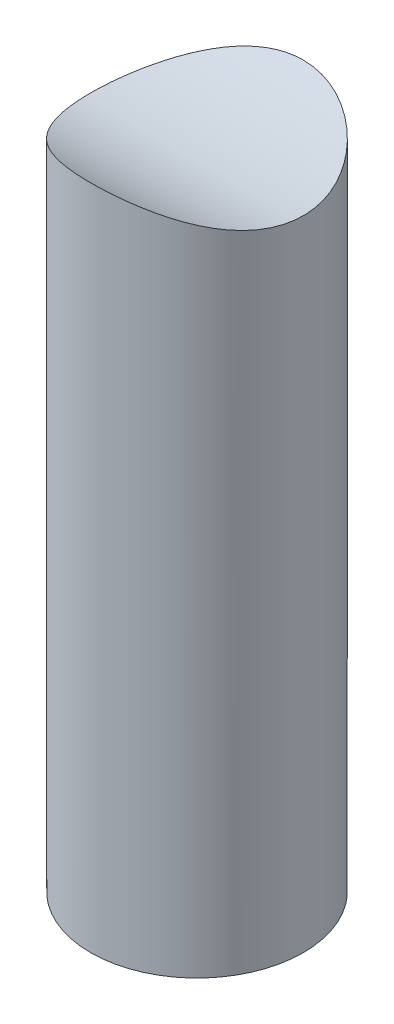
ISO-10303-21;
HEADER;
FILE_DESCRIPTION(('STEP AP214'),'2;1');
FILE_NAME('part.step','',(''),(''),'','','');
FILE_SCHEMA(('AUTOMOTIVE_DESIGN { 1 0 10303 214 1 1 1 1 }'));
ENDSEC;
DATA;
#1=APPLICATION_CONTEXT('core data for automotive mechanical design processes');
#2=APPLICATION_PROTOCOL_DEFINITION('international standard','automotive_design',2000,#1);
#3=PRODUCT_CONTEXT('',#1,'mechanical');
#4=PRODUCT('Part','Part','',(#3));
#5=PRODUCT_RELATED_PRODUCT_CATEGORY('part','',(#4));
#6=PRODUCT_DEFINITION_FORMATION('','',#4);
#7=PRODUCT_DEFINITION_CONTEXT('part definition',#1,'design');
#8=PRODUCT_DEFINITION('design','',#6,#7);
#9=PRODUCT_DEFINITION_SHAPE('','',#8);
#10=(LENGTH_UNIT() NAMED_UNIT(*) SI_UNIT(.MILLI.,.METRE.));
#11=(NAMED_UNIT(*) PLANE_ANGLE_UNIT() SI_UNIT($,.RADIAN.));
#12=(NAMED_UNIT(*) SI_UNIT($,.STERADIAN.) SOLID_ANGLE_UNIT());
#13=UNCERTAINTY_MEASURE_WITH_UNIT(LENGTH_MEASURE(1.E-05),#10,'distance_accuracy_value','');
#14=(GEOMETRIC_REPRESENTATION_CONTEXT(3) GLOBAL_UNCERTAINTY_ASSIGNED_CONTEXT((#13)) GLOBAL_UNIT_ASSIGNED_CONTEXT((#10,
#11,#12)) REPRESENTATION_CONTEXT('',''));
#15=CARTESIAN_POINT('',(0.,0.,0.));
#16=DIRECTION('',(0.,0.,1.));
#17=DIRECTION('',(1.,0.,0.));
#18=AXIS2_PLACEMENT_3D('',#15,#16,#17);
#19=CARTESIAN_POINT('',(0.,170.,0.));
#20=DIRECTION('',(0.,-1.,0.));
#21=DIRECTION('',(0.,0.,-1.));
#22=AXIS2_PLACEMENT_3D('',#19,#20,#21);
#23=CYLINDRICAL_SURFACE('',#22,25.);
#24=CARTESIAN_POINT('',(0.,156.698729810778,-25.));
#25=CARTESIAN_POINT('',(0.651657728078345,156.698726102599,-24.9999972492967));
#26=CARTESIAN_POINT('',(1.30337199528604,156.683968975616,-24.9744865840936));
#27=CARTESIAN_POINT('',(2.60177863889863,156.625488278923,-24.8727781222585));
#28=CARTESIAN_POINT('',(3.24846853548875,156.581751223879,-24.7965567281536));
#29=CARTESIAN_POINT('',(4.53272868796325,156.466842642367,-24.594261965626));
#30=CARTESIAN_POINT('',(5.17027999705686,156.395620838586,-24.4680972258423));
#31=CARTESIAN_POINT('',(6.43045471544741,156.228312381651,-24.1675168252073));
#32=CARTESIAN_POINT('',(7.0530795491345,156.132228111453,-23.9931057884363));
#33=CARTESIAN_POINT('',(8.2762885876815,155.918982708056,-23.599020492088));
#34=CARTESIAN_POINT('',(8.87697298138665,155.801937219328,-23.3795936665704));
#35=CARTESIAN_POINT('',(10.0565840143935,155.549996921812,-22.8969708071432));
#36=CARTESIAN_POINT('',(10.6355102011031,155.415101741997,-22.6337738633895));
#37=CARTESIAN_POINT('',(11.7687683585691,155.131269500991,-22.0657597161742));
#38=CARTESIAN_POINT('',(12.3231060045315,154.982335705071,-21.7609521836511));
#39=CARTESIAN_POINT('',(13.405222067322,154.674170531953,-21.1115697238676));
#40=CARTESIAN_POINT('',(13.9329906242587,154.514935381249,-20.766980187319));
#41=CARTESIAN_POINT('',(15.0020081204318,154.176617367976,-20.0100786450758));
#42=CARTESIAN_POINT('',(15.5407899017115,153.996979746237,-19.5945268058562));
#43=CARTESIAN_POINT('',(16.5821820892583,153.634815066389,-18.7214577237365));
#44=CARTESIAN_POINT('',(17.0847906143755,153.452287858611,-18.2639383011691));
#45=CARTESIAN_POINT('',(18.0517317034124,153.088762861561,-17.3088715339642));
#46=CARTESIAN_POINT('',(18.5160391270901,152.90776614573,-16.8112983153376));
#47=CARTESIAN_POINT('',(19.403358645631,152.5518682561,-15.778873095701));
#48=CARTESIAN_POINT('',(19.8263845601862,152.376965055088,-15.2440336736723));
#49=CARTESIAN_POINT('',(20.6559103346768,152.025882332527,-14.101935890209));
#50=CARTESIAN_POINT('',(21.059348132888,151.850419371306,-13.4922260925484));
#51=CARTESIAN_POINT('',(21.8130164090103,151.516047932167,-12.2363642027715));
#52=CARTESIAN_POINT('',(22.1632438315922,151.357140405022,-11.5902100209449));
#53=CARTESIAN_POINT('',(22.8068723133523,151.060528478018,-10.2658796175507));
#54=CARTESIAN_POINT('',(23.1003009240628,150.92281380477,-9.58771912093295));
#55=CARTESIAN_POINT('',(23.6271574422266,150.672636679532,-8.20398216536624));
#56=CARTESIAN_POINT('',(23.8605917227733,150.560171545489,-7.49840862763115));
#57=CARTESIAN_POINT('',(24.2500719399282,150.370984746237,-6.11654042575088));
#58=CARTESIAN_POINT('',(24.410441753632,150.292289528972,-5.44173347042512));
#59=CARTESIAN_POINT('',(24.6748266692845,150.161924140547,-4.07858290347344));
#60=CARTESIAN_POINT('',(24.7788442214104,150.110252794402,-3.3902398817399));
#61=CARTESIAN_POINT('',(24.9290995504173,150.035454988062,-2.00608536322839));
#62=CARTESIAN_POINT('',(24.9753667718625,150.012313981471,-1.31027785496801));
#63=CARTESIAN_POINT('',(25.0095715600164,149.995216001806,0.0831103975767523));
#64=CARTESIAN_POINT('',(24.9975126954156,150.001257243211,0.78069103076202));
#65=CARTESIAN_POINT('',(24.9188401315975,150.040540224161,2.11091341143743));
#66=CARTESIAN_POINT('',(24.8570687182852,150.071367429604,2.7439201254428));
#67=CARTESIAN_POINT('',(24.6857933574407,150.15641608376,4.00180573261867));
#68=CARTESIAN_POINT('',(24.576292770444,150.210635885435,4.62668519482671));
#69=CARTESIAN_POINT('',(24.3107512890051,150.341171184977,5.86411664160768));
#70=CARTESIAN_POINT('',(24.1547088784611,150.417487402634,6.47666822390543));
#71=CARTESIAN_POINT('',(23.7976713405259,150.590438325392,7.68557846708671));
#72=CARTESIAN_POINT('',(23.5966745985519,150.687073760274,8.28193654550033));
#73=CARTESIAN_POINT('',(23.1485341467428,150.899946742023,9.46307781020892));
#74=CARTESIAN_POINT('',(22.9007934938713,151.016435724322,10.0475888012673));
#75=CARTESIAN_POINT('',(22.3631542092352,151.265475051268,11.1932924970822));
#76=CARTESIAN_POINT('',(22.073255627975,151.398025376674,11.7544852297725));
#77=CARTESIAN_POINT('',(21.4533967659483,151.676387347871,12.8510127622086));
#78=CARTESIAN_POINT('',(21.1234266116358,151.822202259796,13.3863411434307));
#79=CARTESIAN_POINT('',(20.4256190341222,152.124046152466,14.4287052512528));
#80=CARTESIAN_POINT('',(20.0577785424352,152.280075960511,14.9357386800821));
#81=CARTESIAN_POINT('',(19.2498172622248,152.614267094071,15.9659829272969));
#82=CARTESIAN_POINT('',(18.8061507663467,152.793126121976,16.4861908868765));
#83=CARTESIAN_POINT('',(17.878545130929,153.154936561063,17.4878151609516));
#84=CARTESIAN_POINT('',(17.3946036999607,153.33788820466,17.9692292652126));
#85=CARTESIAN_POINT('',(16.3884818333071,153.703535708244,18.8913612335406));
#86=CARTESIAN_POINT('',(15.8662738391005,153.88623128538,19.3320492409618));
#87=CARTESIAN_POINT('',(15.0565544991402,154.156406045986,19.9603840123244));
#88=CARTESIAN_POINT('',(14.7822362181157,154.245822760084,20.1643863204588));
#89=CARTESIAN_POINT('',(14.2249760149928,154.422811534991,20.5613013775411));
#90=CARTESIAN_POINT('',(13.942031409767,154.510383007234,20.7542106211332));
#91=CARTESIAN_POINT('',(13.0443742119748,154.780350872914,21.339529527128));
#92=CARTESIAN_POINT('',(12.415048704098,154.958416893747,21.7118230929146));
#93=CARTESIAN_POINT('',(11.1225584877746,155.297396930522,22.401452093898));
#94=CARTESIAN_POINT('',(10.4593967999659,155.45831247358,22.7187924238286));
#95=CARTESIAN_POINT('',(9.4426682570212,155.68234367834,23.1510609956445));
#96=CARTESIAN_POINT('',(9.10016001198919,155.754118682352,23.2878388705815));
#97=CARTESIAN_POINT('',(8.40838786333442,155.891202614516,23.5464514655133));
#98=CARTESIAN_POINT('',(8.05912571077177,155.956513192505,23.6682900002));
#99=CARTESIAN_POINT('',(7.00201342033251,156.141732526669,24.0108330854159));
#100=CARTESIAN_POINT('',(6.28464457283938,156.250972021935,24.2086472902985));
#101=CARTESIAN_POINT('',(4.88870901344563,156.428694622522,24.5269620029075));
#102=CARTESIAN_POINT('',(4.2115687336296,156.499720340148,24.6523447935619));
#103=CARTESIAN_POINT('',(2.84669344068968,156.610584845304,24.8469575763003));
#104=CARTESIAN_POINT('',(2.15895902852084,156.650425395227,24.916190741622));
#105=CARTESIAN_POINT('',(0.779421212571212,156.697199690344,24.9973937987513));
#106=CARTESIAN_POINT('',(0.0876205201857553,156.704153315676,25.0093982853171));
#107=CARTESIAN_POINT('',(-1.29410670579055,156.684902750013,24.9760435062342));
#108=CARTESIAN_POINT('',(-1.98403336273574,156.65870079715,24.9306881126047));
#109=CARTESIAN_POINT('',(-3.2805525639814,156.57892066196,24.7914377927162));
#110=CARTESIAN_POINT('',(-3.88799241923916,156.528656972616,24.7034064080223));
#111=CARTESIAN_POINT('',(-5.09235719600756,156.404433818337,24.4835158457237));
#112=CARTESIAN_POINT('',(-5.6892830434807,156.33047645121,24.3516605481936));
#113=CARTESIAN_POINT('',(-6.8691599775555,156.16115542875,24.0455037172597));
#114=CARTESIAN_POINT('',(-7.45210761033613,156.065786542041,23.8711918097489));
#115=CARTESIAN_POINT('',(-8.60077796778291,155.856434561225,23.4817897713769));
#116=CARTESIAN_POINT('',(-9.16649963911455,155.742450331526,23.2666971526418));
#117=CARTESIAN_POINT('',(-10.3036310513174,155.493337501565,22.7866934178469));
#118=CARTESIAN_POINT('',(-10.8741040265233,155.357477140771,22.5199449130062));
#119=CARTESIAN_POINT('',(-11.9909294700445,155.072384103727,21.9456625079577));
#120=CARTESIAN_POINT('',(-12.5372714883265,154.923145717188,21.6381111642824));
#121=CARTESIAN_POINT('',(-13.6034940304572,154.615041223326,20.9841879069052));
#122=CARTESIAN_POINT('',(-14.1233692262792,154.456173191452,20.6378082212681));
#123=CARTESIAN_POINT('',(-15.1345879150036,154.132514291547,19.9081156666699));
#124=CARTESIAN_POINT('',(-15.625929372136,153.967723002269,19.5248001676595));
#125=CARTESIAN_POINT('',(-16.6383010122432,153.614868553049,18.6723933753344));
#126=CARTESIAN_POINT('',(-17.1552571745104,153.426492131722,18.1985814957771));
#127=CARTESIAN_POINT('',(-18.1479612677744,153.051760491651,17.208801457832));
#128=CARTESIAN_POINT('',(-18.6237060214299,152.865405429718,16.6928300549538));
#129=CARTESIAN_POINT('',(-19.5313825427206,152.499448967224,15.6210867099589));
#130=CARTESIAN_POINT('',(-19.9632988201806,152.319849968455,15.0653008138923));
#131=CARTESIAN_POINT('',(-20.78021650138,151.972083282925,13.9168654136765));
#132=CARTESIAN_POINT('',(-21.1652183667226,151.803915483698,13.324216272321));
#133=CARTESIAN_POINT('',(-21.8948385164209,151.479134482644,12.0890056860871));
#134=CARTESIAN_POINT('',(-22.2381140666933,151.322946314822,11.445537083859));
#135=CARTESIAN_POINT('',(-22.8686774667118,151.031661359495,10.1270695634352));
#136=CARTESIAN_POINT('',(-23.1559634400449,150.896565278892,9.45206958944887));
#137=CARTESIAN_POINT('',(-23.6710809469709,150.651557714965,8.07584855033877));
#138=CARTESIAN_POINT('',(-23.8989549518689,150.5416282479,7.3746466282172));
#139=CARTESIAN_POINT('',(-24.2925476674675,150.350244311774,5.9512332801707));
#140=CARTESIAN_POINT('',(-24.458273748637,150.268786466182,5.2290243565372));
#141=CARTESIAN_POINT('',(-24.7129738270469,150.143004095337,3.83701251064258));
#142=CARTESIAN_POINT('',(-24.8075966684247,150.095957379788,3.16848428122955));
#143=CARTESIAN_POINT('',(-24.9424667472851,150.028776363386,1.82462999197065));
#144=CARTESIAN_POINT('',(-24.9827174357542,150.00864035452,1.14930436629496));
#145=CARTESIAN_POINT('',(-25.0083162364952,149.995842507858,-0.202439854909059));
#146=CARTESIAN_POINT('',(-24.9936807058504,150.003172484704,-0.878858064769205));
#147=CARTESIAN_POINT('',(-24.9097358222379,150.045084252977,-2.22742891911759));
#148=CARTESIAN_POINT('',(-24.8404279743976,150.079665294183,-2.89958168052));
#149=CARTESIAN_POINT('',(-24.6543998024786,150.171961601168,-4.19012849545484));
#150=CARTESIAN_POINT('',(-24.5411116057829,150.227998883899,-4.80914210853196));
#151=CARTESIAN_POINT('',(-24.2688562352993,150.361674888653,-6.03461366863557));
#152=CARTESIAN_POINT('',(-24.109891640303,150.439312391167,-6.64107232241653));
#153=CARTESIAN_POINT('',(-23.747849994662,150.614422219811,-7.83775931737804));
#154=CARTESIAN_POINT('',(-23.5447695147136,150.711896087864,-8.42798639279271));
#155=CARTESIAN_POINT('',(-23.0963397362171,150.924527969823,-9.58886482620042));
#156=CARTESIAN_POINT('',(-22.8509884649227,151.039686809047,-10.1595152690755));
#157=CARTESIAN_POINT('',(-22.308659364884,151.290493438379,-11.3022392748832));
#158=CARTESIAN_POINT('',(-22.0099237661831,151.426806368824,-11.8733321215653));
#159=CARTESIAN_POINT('',(-21.3709751726378,151.712972731464,-12.9882367601858));
#160=CARTESIAN_POINT('',(-21.030761401556,151.862826417052,-13.5320480412983));
#161=CARTESIAN_POINT('',(-20.3110145040853,152.17289671205,-14.5901418631954));
#162=CARTESIAN_POINT('',(-19.9314678829649,152.33311687097,-15.1044141747537));
#163=CARTESIAN_POINT('',(-19.135326866118,152.660491491567,-16.1011229628171));
#164=CARTESIAN_POINT('',(-18.7187291259197,152.827646578507,-16.5835565584941));
#165=CARTESIAN_POINT('',(-17.8073460558901,153.182180643234,-17.5609868614201));
#166=CARTESIAN_POINT('',(-17.3089057811131,153.369916199584,-18.0524521311882));
#167=CARTESIAN_POINT('',(-16.2724114852239,153.744644309891,-18.9920498989603));
#168=CARTESIAN_POINT('',(-15.7343545615363,153.931636808346,-19.4401792163128));
#169=CARTESIAN_POINT('',(-14.6207785923102,154.299991142604,-20.2909910624585));
#170=CARTESIAN_POINT('',(-14.0452252134736,154.481347586901,-20.6936309903305));
#171=CARTESIAN_POINT('',(-12.859787725171,154.833043184198,-21.4504110417563));
#172=CARTESIAN_POINT('',(-12.2499062502337,155.00338318051,-21.8045548800276));
#173=CARTESIAN_POINT('',(-11.3018607185228,155.249191353947,-22.3024856266454));
#174=CARTESIAN_POINT('',(-10.9750333120999,155.330678832836,-22.4651334968817));
#175=CARTESIAN_POINT('',(-10.3136429723918,155.488562379384,-22.7763547859923));
#176=CARTESIAN_POINT('',(-9.97908184493879,155.564959619762,-22.9249314500231));
#177=CARTESIAN_POINT('',(-8.96426144522224,155.785496094388,-23.3490772961765));
#178=CARTESIAN_POINT('',(-8.27288359513331,155.920975233029,-23.6030526309905));
#179=CARTESIAN_POINT('',(-6.86794293612771,156.162902102926,-24.0493909122374));
#180=CARTESIAN_POINT('',(-6.15445136020555,156.269434051224,-24.2419328799137));
#181=CARTESIAN_POINT('',(-4.70954394909074,156.449259858034,-24.5635340961408));
#182=CARTESIAN_POINT('',(-3.97814102285207,156.522576952624,-24.6926377295426));
#183=CARTESIAN_POINT('',(-2.70500982979901,156.617623109471,-24.8591156657607));
#184=CARTESIAN_POINT('',(-2.16587885060814,156.647964119396,-24.91189663269));
#185=CARTESIAN_POINT('',(-1.08451176835221,156.688519686135,-24.9823411189456));
#186=CARTESIAN_POINT('',(-0.542275459994336,156.698732896531,-25.0000022889913));
#187=CARTESIAN_POINT('',(0.,156.698729810778,-25.));
#188=B_SPLINE_CURVE_WITH_KNOTS('',3,(#24,#25,#26,#27,#28,#29,#30,#31,#32,#33,#34,#35,#36,#37,
#38,#39,#40,#41,#42,#43,#44,#45,#46,#47,#48,#49,#50,#51,#52,#53,#54,#55,#56,#57,#58,#59,#60,#61,
#62,#63,#64,#65,#66,#67,#68,#69,#70,#71,#72,#73,#74,#75,#76,#77,#78,#79,#80,#81,#82,#83,#84,#85,
#86,#87,#88,#89,#90,#91,#92,#93,#94,#95,#96,#97,#98,#99,#100,#101,#102,#103,#104,#105,#106,#107,
#108,#109,#110,#111,#112,#113,#114,#115,#116,#117,#118,#119,#120,#121,#122,#123,#124,#125,#126,
#127,#128,#129,#130,#131,#132,#133,#134,#135,#136,#137,#138,#139,#140,#141,#142,#143,#144,#145,
#146,#147,#148,#149,#150,#151,#152,#153,#154,#155,#156,#157,#158,#159,#160,#161,#162,#163,#164,
#165,#166,#167,#168,#169,#170,#171,#172,#173,#174,#175,#176,#177,#178,#179,#180,#181,#182,#183,
#184,#185,#186,#187),.UNSPECIFIED.,.T.,.F.,(4,2,2,2,2,2,2,2,2,2,2,2,2,2,2,2,2,2,2,2,2,2,2,2,2,2,
2,2,2,2,2,2,2,2,2,2,2,2,2,2,2,2,2,2,2,2,2,2,2,2,2,2,2,2,2,2,2,2,2,2,2,2,2,2,2,2,2,2,2,2,2,2,2,2,
2,2,2,2,2,2,2,4),(0.,1.95441192278272,3.90973393836879,5.86864987236744,7.82737812256329,
9.77561538455969,11.723893149394,13.6717188730885,15.620262192923,17.7292201070748,
19.8382876161037,21.9487286473746,24.0584607311283,26.3111473362998,28.5639632414418,
30.8156836143288,33.067164691916,35.1584826548101,37.2497096806103,39.339870037992,
41.4299025102114,43.3379272290007,45.2458176284876,47.153770184371,49.0617912774175,
50.9960675392925,52.9303414839626,54.8650930001225,56.8000014052271,58.9178481891629,
61.0358155497571,63.1553234931732,64.2151556831173,65.2753209551758,67.5299925667647,
69.7844632493247,70.9112804180446,72.0378092573376,74.2902273803598,76.3642610710997,
78.4381775418091,80.5108401701136,82.5833628929462,84.4287799170669,86.2740335954544,
88.1197386074929,89.965556255128,91.8963352398347,93.8279423204728,95.7599367269954,
97.6920688048028,99.8679420645493,102.043982932003,104.220790212283,106.39757607266,
108.632125578475,110.866749959239,113.099772486652,115.332530103652,117.360339064742,
119.388019315274,121.415095328543,123.442115538416,125.335316614567,127.228410825634,
129.121652247157,131.014982048795,132.989197931268,134.9634507656,136.938383204219,
138.913494094206,141.085252835438,143.257170852589,145.431106304714,147.604875143848,
148.726679825932,149.848225159809,152.091379766987,154.327936660809,156.562926503801,
158.1891770497,159.815536377274),.UNSPECIFIED.);
#189=CARTESIAN_POINT('',(0.,156.698729810778,-25.));
#190=VERTEX_POINT('',#189);
#191=EDGE_CURVE('E10',#190,#190,#188,.T.);
#192=ORIENTED_EDGE('',*,*,#191,.T.);
#193=EDGE_LOOP('',(#192));
#194=FACE_BOUND('',#193,.T.);
#195=CARTESIAN_POINT('',(0.,0.,0.));
#196=DIRECTION('',(0.,1.,0.));
#197=DIRECTION('',(0.,0.,1.));
#198=AXIS2_PLACEMENT_3D('',#195,#196,#197);
#199=CIRCLE('',#198,25.);
#200=CARTESIAN_POINT('',(0.,0.,25.));
#201=VERTEX_POINT('',#200);
#202=EDGE_CURVE('E42',#201,#201,#199,.T.);
#203=ORIENTED_EDGE('',*,*,#202,.T.);
#204=EDGE_LOOP('',(#203));
#205=FACE_BOUND('',#204,.T.);
#206=ADVANCED_FACE('F31',(#194,#205),#23,.T.);
#207=CARTESIAN_POINT('',(0.,0.,0.));
#208=DIRECTION('',(0.,1.,0.));
#209=DIRECTION('',(0.,0.,1.));
#210=AXIS2_PLACEMENT_3D('',#207,#208,#209);
#211=PLANE('',#210);
#212=ORIENTED_EDGE('',*,*,#202,.F.);
#213=EDGE_LOOP('',(#212));
#214=FACE_BOUND('',#213,.T.);
#215=ADVANCED_FACE('F49',(#214),#211,.F.);
#216=CARTESIAN_POINT('',(-25.,200.,0.));
#217=DIRECTION('',(1.,0.,0.));
#218=DIRECTION('',(0.,0.,-1.));
#219=AXIS2_PLACEMENT_3D('',#216,#217,#218);
#220=CYLINDRICAL_SURFACE('',#219,50.);
#221=ORIENTED_EDGE('',*,*,#191,.F.);
#222=EDGE_LOOP('',(#221));
#223=FACE_BOUND('',#222,.T.);
#224=ADVANCED_FACE('F51',(#223),#220,.F.);
#225=CLOSED_SHELL('',(#206,#215,#224));
#226=MANIFOLD_SOLID_BREP('B2',#225);
#227=ADVANCED_BREP_SHAPE_REPRESENTATION('',(#18,#226),#14);
#228=SHAPE_DEFINITION_REPRESENTATION(#9,#227);
ENDSEC;
END-ISO-10303-21;
